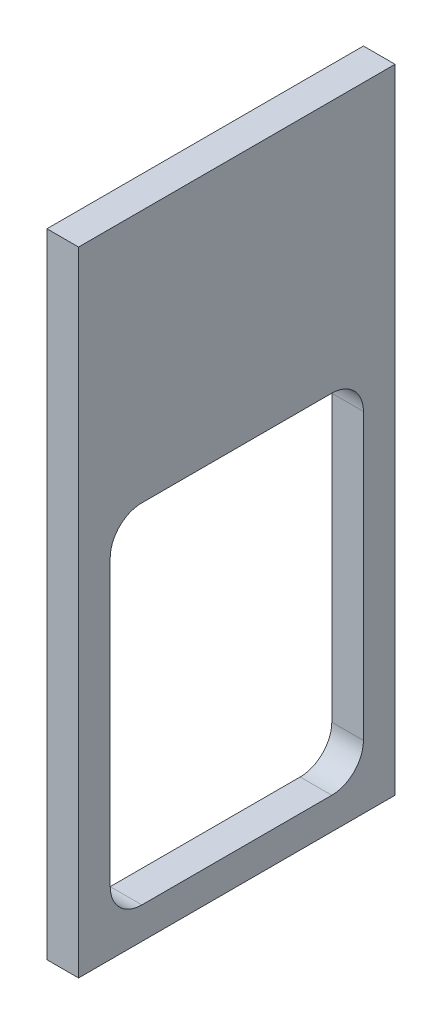
ISO-10303-21;
HEADER;
FILE_DESCRIPTION(('STEP AP214'),'2;1');
FILE_NAME('part.step','',(''),(''),'','','');
FILE_SCHEMA(('AUTOMOTIVE_DESIGN { 1 0 10303 214 1 1 1 1 }'));
ENDSEC;
DATA;
#1=APPLICATION_CONTEXT('core data for automotive mechanical design processes');
#2=APPLICATION_PROTOCOL_DEFINITION('international standard','automotive_design',2000,#1);
#3=PRODUCT_CONTEXT('',#1,'mechanical');
#4=PRODUCT('Part','Part','',(#3));
#5=PRODUCT_RELATED_PRODUCT_CATEGORY('part','',(#4));
#6=PRODUCT_DEFINITION_FORMATION('','',#4);
#7=PRODUCT_DEFINITION_CONTEXT('part definition',#1,'design');
#8=PRODUCT_DEFINITION('design','',#6,#7);
#9=PRODUCT_DEFINITION_SHAPE('','',#8);
#10=(LENGTH_UNIT() NAMED_UNIT(*) SI_UNIT(.MILLI.,.METRE.));
#11=(NAMED_UNIT(*) PLANE_ANGLE_UNIT() SI_UNIT($,.RADIAN.));
#12=(NAMED_UNIT(*) SI_UNIT($,.STERADIAN.) SOLID_ANGLE_UNIT());
#13=UNCERTAINTY_MEASURE_WITH_UNIT(LENGTH_MEASURE(1.E-05),#10,'distance_accuracy_value','');
#14=(GEOMETRIC_REPRESENTATION_CONTEXT(3) GLOBAL_UNCERTAINTY_ASSIGNED_CONTEXT((#13)) GLOBAL_UNIT_ASSIGNED_CONTEXT((#10,
#11,#12)) REPRESENTATION_CONTEXT('',''));
#15=CARTESIAN_POINT('',(0.,0.,0.));
#16=DIRECTION('',(0.,0.,1.));
#17=DIRECTION('',(1.,0.,0.));
#18=AXIS2_PLACEMENT_3D('',#15,#16,#17);
#19=CARTESIAN_POINT('',(10.,-100.,-50.));
#20=DIRECTION('',(0.,0.,1.));
#21=DIRECTION('',(1.,0.,0.));
#22=AXIS2_PLACEMENT_3D('',#19,#20,#21);
#23=PLANE('',#22);
#24=DIRECTION('',(0.,1.,0.));
#25=VECTOR('',#24,1.);
#26=CARTESIAN_POINT('',(0.,-100.,-50.));
#27=LINE('',#26,#25);
#28=CARTESIAN_POINT('',(0.,-100.,-50.));
#29=VERTEX_POINT('',#28);
#30=CARTESIAN_POINT('',(0.,100.,-50.));
#31=VERTEX_POINT('',#30);
#32=EDGE_CURVE('E160',#29,#31,#27,.T.);
#33=ORIENTED_EDGE('',*,*,#32,.T.);
#34=DIRECTION('',(-1.,0.,0.));
#35=VECTOR('',#34,1.);
#36=CARTESIAN_POINT('',(10.,100.,-50.));
#37=LINE('',#36,#35);
#38=CARTESIAN_POINT('',(10.,100.,-50.));
#39=VERTEX_POINT('',#38);
#40=EDGE_CURVE('E139',#39,#31,#37,.T.);
#41=ORIENTED_EDGE('',*,*,#40,.F.);
#42=DIRECTION('',(0.,1.,0.));
#43=VECTOR('',#42,1.);
#44=CARTESIAN_POINT('',(10.,-100.,-50.));
#45=LINE('',#44,#43);
#46=CARTESIAN_POINT('',(10.,-100.,-50.));
#47=VERTEX_POINT('',#46);
#48=EDGE_CURVE('E147',#47,#39,#45,.T.);
#49=ORIENTED_EDGE('',*,*,#48,.F.);
#50=DIRECTION('',(-1.,0.,0.));
#51=VECTOR('',#50,1.);
#52=CARTESIAN_POINT('',(10.,-100.,-50.));
#53=LINE('',#52,#51);
#54=EDGE_CURVE('E259',#47,#29,#53,.T.);
#55=ORIENTED_EDGE('',*,*,#54,.T.);
#56=EDGE_LOOP('',(#33,#41,#49,#55));
#57=FACE_BOUND('',#56,.T.);
#58=ADVANCED_FACE('F45',(#57),#23,.F.);
#59=CARTESIAN_POINT('',(10.,100.,50.));
#60=DIRECTION('',(0.,-1.,0.));
#61=DIRECTION('',(0.,0.,-1.));
#62=AXIS2_PLACEMENT_3D('',#59,#60,#61);
#63=PLANE('',#62);
#64=DIRECTION('',(0.,0.,1.));
#65=VECTOR('',#64,1.);
#66=CARTESIAN_POINT('',(0.,100.,50.));
#67=LINE('',#66,#65);
#68=CARTESIAN_POINT('',(0.,100.,50.));
#69=VERTEX_POINT('',#68);
#70=EDGE_CURVE('E262',#31,#69,#67,.T.);
#71=ORIENTED_EDGE('',*,*,#70,.T.);
#72=DIRECTION('',(-1.,0.,0.));
#73=VECTOR('',#72,1.);
#74=CARTESIAN_POINT('',(10.,100.,50.));
#75=LINE('',#74,#73);
#76=CARTESIAN_POINT('',(10.,100.,50.));
#77=VERTEX_POINT('',#76);
#78=EDGE_CURVE('E142',#77,#69,#75,.T.);
#79=ORIENTED_EDGE('',*,*,#78,.F.);
#80=DIRECTION('',(0.,0.,1.));
#81=VECTOR('',#80,1.);
#82=CARTESIAN_POINT('',(10.,100.,50.));
#83=LINE('',#82,#81);
#84=EDGE_CURVE('E135',#39,#77,#83,.T.);
#85=ORIENTED_EDGE('',*,*,#84,.F.);
#86=ORIENTED_EDGE('',*,*,#40,.T.);
#87=EDGE_LOOP('',(#71,#79,#85,#86));
#88=FACE_BOUND('',#87,.T.);
#89=ADVANCED_FACE('F137',(#88),#63,.F.);
#90=CARTESIAN_POINT('',(10.,-100.,50.));
#91=DIRECTION('',(0.,0.,-1.));
#92=DIRECTION('',(-1.,0.,0.));
#93=AXIS2_PLACEMENT_3D('',#90,#91,#92);
#94=PLANE('',#93);
#95=DIRECTION('',(0.,-1.,0.));
#96=VECTOR('',#95,1.);
#97=CARTESIAN_POINT('',(0.,-100.,50.));
#98=LINE('',#97,#96);
#99=CARTESIAN_POINT('',(0.,-100.,50.));
#100=VERTEX_POINT('',#99);
#101=EDGE_CURVE('E265',#69,#100,#98,.T.);
#102=ORIENTED_EDGE('',*,*,#101,.T.);
#103=DIRECTION('',(-1.,0.,0.));
#104=VECTOR('',#103,1.);
#105=CARTESIAN_POINT('',(10.,-100.,50.));
#106=LINE('',#105,#104);
#107=CARTESIAN_POINT('',(10.,-100.,50.));
#108=VERTEX_POINT('',#107);
#109=EDGE_CURVE('E168',#108,#100,#106,.T.);
#110=ORIENTED_EDGE('',*,*,#109,.F.);
#111=DIRECTION('',(0.,-1.,0.));
#112=VECTOR('',#111,1.);
#113=CARTESIAN_POINT('',(10.,-100.,50.));
#114=LINE('',#113,#112);
#115=EDGE_CURVE('E146',#77,#108,#114,.T.);
#116=ORIENTED_EDGE('',*,*,#115,.F.);
#117=ORIENTED_EDGE('',*,*,#78,.T.);
#118=EDGE_LOOP('',(#102,#110,#116,#117));
#119=FACE_BOUND('',#118,.T.);
#120=ADVANCED_FACE('F281',(#119),#94,.F.);
#121=CARTESIAN_POINT('',(10.,-100.,50.));
#122=DIRECTION('',(0.,1.,0.));
#123=DIRECTION('',(0.,0.,1.));
#124=AXIS2_PLACEMENT_3D('',#121,#122,#123);
#125=PLANE('',#124);
#126=DIRECTION('',(0.,0.,-1.));
#127=VECTOR('',#126,1.);
#128=CARTESIAN_POINT('',(0.,-100.,50.));
#129=LINE('',#128,#127);
#130=EDGE_CURVE('E157',#100,#29,#129,.T.);
#131=ORIENTED_EDGE('',*,*,#130,.T.);
#132=ORIENTED_EDGE('',*,*,#54,.F.);
#133=DIRECTION('',(0.,0.,-1.));
#134=VECTOR('',#133,1.);
#135=CARTESIAN_POINT('',(10.,-100.,50.));
#136=LINE('',#135,#134);
#137=EDGE_CURVE('E152',#108,#47,#136,.T.);
#138=ORIENTED_EDGE('',*,*,#137,.F.);
#139=ORIENTED_EDGE('',*,*,#109,.T.);
#140=EDGE_LOOP('',(#131,#132,#138,#139));
#141=FACE_BOUND('',#140,.T.);
#142=ADVANCED_FACE('F276',(#141),#125,.F.);
#143=CARTESIAN_POINT('',(10.,0.,0.));
#144=DIRECTION('',(-1.,0.,0.));
#145=DIRECTION('',(0.,0.,1.));
#146=AXIS2_PLACEMENT_3D('',#143,#144,#145);
#147=PLANE('',#146);
#148=DIRECTION('',(0.,0.,-1.));
#149=VECTOR('',#148,1.);
#150=CARTESIAN_POINT('',(10.,-90.,40.));
#151=LINE('',#150,#149);
#152=CARTESIAN_POINT('',(10.,-90.,30.));
#153=VERTEX_POINT('',#152);
#154=CARTESIAN_POINT('',(10.,-90.,-30.));
#155=VERTEX_POINT('',#154);
#156=EDGE_CURVE('E218',#153,#155,#151,.T.);
#157=ORIENTED_EDGE('',*,*,#156,.F.);
#158=CARTESIAN_POINT('',(10.,-80.,30.));
#159=DIRECTION('',(-1.,0.,0.));
#160=DIRECTION('',(0.,0.,1.));
#161=AXIS2_PLACEMENT_3D('',#158,#159,#160);
#162=CIRCLE('',#161,10.);
#163=CARTESIAN_POINT('',(10.,-80.,40.));
#164=VERTEX_POINT('',#163);
#165=EDGE_CURVE('E54',#153,#164,#162,.T.);
#166=ORIENTED_EDGE('',*,*,#165,.T.);
#167=DIRECTION('',(0.,-1.,0.));
#168=VECTOR('',#167,1.);
#169=CARTESIAN_POINT('',(10.,-90.,40.));
#170=LINE('',#169,#168);
#171=CARTESIAN_POINT('',(10.,10.,40.));
#172=VERTEX_POINT('',#171);
#173=EDGE_CURVE('E217',#172,#164,#170,.T.);
#174=ORIENTED_EDGE('',*,*,#173,.F.);
#175=CARTESIAN_POINT('',(10.,10.,30.));
#176=DIRECTION('',(-1.,0.,0.));
#177=DIRECTION('',(0.,0.,1.));
#178=AXIS2_PLACEMENT_3D('',#175,#176,#177);
#179=CIRCLE('',#178,10.);
#180=CARTESIAN_POINT('',(10.,20.,30.));
#181=VERTEX_POINT('',#180);
#182=EDGE_CURVE('E195',#172,#181,#179,.T.);
#183=ORIENTED_EDGE('',*,*,#182,.T.);
#184=DIRECTION('',(0.,0.,1.));
#185=VECTOR('',#184,1.);
#186=CARTESIAN_POINT('',(10.,20.,40.));
#187=LINE('',#186,#185);
#188=CARTESIAN_POINT('',(10.,20.,-30.));
#189=VERTEX_POINT('',#188);
#190=EDGE_CURVE('E240',#189,#181,#187,.T.);
#191=ORIENTED_EDGE('',*,*,#190,.F.);
#192=CARTESIAN_POINT('',(10.,10.,-30.));
#193=DIRECTION('',(-1.,0.,0.));
#194=DIRECTION('',(0.,0.,1.));
#195=AXIS2_PLACEMENT_3D('',#192,#193,#194);
#196=CIRCLE('',#195,10.);
#197=CARTESIAN_POINT('',(10.,10.,-40.));
#198=VERTEX_POINT('',#197);
#199=EDGE_CURVE('E201',#189,#198,#196,.T.);
#200=ORIENTED_EDGE('',*,*,#199,.T.);
#201=DIRECTION('',(0.,1.,0.));
#202=VECTOR('',#201,1.);
#203=CARTESIAN_POINT('',(10.,-90.,-40.));
#204=LINE('',#203,#202);
#205=CARTESIAN_POINT('',(10.,-80.,-40.));
#206=VERTEX_POINT('',#205);
#207=EDGE_CURVE('E248',#206,#198,#204,.T.);
#208=ORIENTED_EDGE('',*,*,#207,.F.);
#209=CARTESIAN_POINT('',(10.,-80.,-30.));
#210=DIRECTION('',(-1.,0.,0.));
#211=DIRECTION('',(0.,0.,1.));
#212=AXIS2_PLACEMENT_3D('',#209,#210,#211);
#213=CIRCLE('',#212,10.);
#214=EDGE_CURVE('E207',#206,#155,#213,.T.);
#215=ORIENTED_EDGE('',*,*,#214,.T.);
#216=EDGE_LOOP('',(#157,#166,#174,#183,#191,#200,#208,#215));
#217=FACE_BOUND('',#216,.T.);
#218=ORIENTED_EDGE('',*,*,#48,.T.);
#219=ORIENTED_EDGE('',*,*,#84,.T.);
#220=ORIENTED_EDGE('',*,*,#115,.T.);
#221=ORIENTED_EDGE('',*,*,#137,.T.);
#222=EDGE_LOOP('',(#218,#219,#220,#221));
#223=FACE_BOUND('',#222,.T.);
#224=ADVANCED_FACE('F150',(#217,#223),#147,.F.);
#225=CARTESIAN_POINT('',(0.,0.,0.));
#226=DIRECTION('',(-1.,0.,0.));
#227=DIRECTION('',(0.,0.,1.));
#228=AXIS2_PLACEMENT_3D('',#225,#226,#227);
#229=PLANE('',#228);
#230=DIRECTION('',(0.,0.,1.));
#231=VECTOR('',#230,1.);
#232=CARTESIAN_POINT('',(0.,20.,40.));
#233=LINE('',#232,#231);
#234=CARTESIAN_POINT('',(0.,20.,-30.));
#235=VERTEX_POINT('',#234);
#236=CARTESIAN_POINT('',(0.,20.,30.));
#237=VERTEX_POINT('',#236);
#238=EDGE_CURVE('E238',#235,#237,#233,.T.);
#239=ORIENTED_EDGE('',*,*,#238,.T.);
#240=CARTESIAN_POINT('',(0.,10.,30.));
#241=DIRECTION('',(-1.,0.,0.));
#242=DIRECTION('',(0.,0.,1.));
#243=AXIS2_PLACEMENT_3D('',#240,#241,#242);
#244=CIRCLE('',#243,10.);
#245=CARTESIAN_POINT('',(0.,10.,40.));
#246=VERTEX_POINT('',#245);
#247=EDGE_CURVE('E198',#237,#246,#244,.F.);
#248=ORIENTED_EDGE('',*,*,#247,.T.);
#249=DIRECTION('',(0.,-1.,0.));
#250=VECTOR('',#249,1.);
#251=CARTESIAN_POINT('',(0.,-90.,40.));
#252=LINE('',#251,#250);
#253=CARTESIAN_POINT('',(0.,-80.,40.));
#254=VERTEX_POINT('',#253);
#255=EDGE_CURVE('E233',#246,#254,#252,.T.);
#256=ORIENTED_EDGE('',*,*,#255,.T.);
#257=CARTESIAN_POINT('',(0.,-80.,30.));
#258=DIRECTION('',(-1.,0.,0.));
#259=DIRECTION('',(0.,0.,1.));
#260=AXIS2_PLACEMENT_3D('',#257,#258,#259);
#261=CIRCLE('',#260,10.);
#262=CARTESIAN_POINT('',(0.,-90.,30.));
#263=VERTEX_POINT('',#262);
#264=EDGE_CURVE('E11',#254,#263,#261,.F.);
#265=ORIENTED_EDGE('',*,*,#264,.T.);
#266=DIRECTION('',(0.,0.,-1.));
#267=VECTOR('',#266,1.);
#268=CARTESIAN_POINT('',(0.,-90.,40.));
#269=LINE('',#268,#267);
#270=CARTESIAN_POINT('',(0.,-90.,-30.));
#271=VERTEX_POINT('',#270);
#272=EDGE_CURVE('E229',#263,#271,#269,.T.);
#273=ORIENTED_EDGE('',*,*,#272,.T.);
#274=CARTESIAN_POINT('',(0.,-80.,-30.));
#275=DIRECTION('',(-1.,0.,0.));
#276=DIRECTION('',(0.,0.,1.));
#277=AXIS2_PLACEMENT_3D('',#274,#275,#276);
#278=CIRCLE('',#277,10.);
#279=CARTESIAN_POINT('',(0.,-80.,-40.));
#280=VERTEX_POINT('',#279);
#281=EDGE_CURVE('E210',#271,#280,#278,.F.);
#282=ORIENTED_EDGE('',*,*,#281,.T.);
#283=DIRECTION('',(0.,1.,0.));
#284=VECTOR('',#283,1.);
#285=CARTESIAN_POINT('',(0.,-90.,-40.));
#286=LINE('',#285,#284);
#287=CARTESIAN_POINT('',(0.,10.,-40.));
#288=VERTEX_POINT('',#287);
#289=EDGE_CURVE('E232',#280,#288,#286,.T.);
#290=ORIENTED_EDGE('',*,*,#289,.T.);
#291=CARTESIAN_POINT('',(0.,10.,-30.));
#292=DIRECTION('',(-1.,0.,0.));
#293=DIRECTION('',(0.,0.,1.));
#294=AXIS2_PLACEMENT_3D('',#291,#292,#293);
#295=CIRCLE('',#294,10.);
#296=EDGE_CURVE('E204',#288,#235,#295,.F.);
#297=ORIENTED_EDGE('',*,*,#296,.T.);
#298=EDGE_LOOP('',(#239,#248,#256,#265,#273,#282,#290,#297));
#299=FACE_BOUND('',#298,.T.);
#300=ORIENTED_EDGE('',*,*,#32,.F.);
#301=ORIENTED_EDGE('',*,*,#130,.F.);
#302=ORIENTED_EDGE('',*,*,#101,.F.);
#303=ORIENTED_EDGE('',*,*,#70,.F.);
#304=EDGE_LOOP('',(#300,#301,#302,#303));
#305=FACE_BOUND('',#304,.T.);
#306=ADVANCED_FACE('F280',(#299,#305),#229,.T.);
#307=CARTESIAN_POINT('',(0.,-90.,40.));
#308=DIRECTION('',(0.,0.,1.));
#309=DIRECTION('',(1.,0.,0.));
#310=AXIS2_PLACEMENT_3D('',#307,#308,#309);
#311=PLANE('',#310);
#312=ORIENTED_EDGE('',*,*,#255,.F.);
#313=DIRECTION('',(1.,0.,0.));
#314=VECTOR('',#313,1.);
#315=CARTESIAN_POINT('',(10.,10.,40.));
#316=LINE('',#315,#314);
#317=EDGE_CURVE('E166',#246,#172,#316,.T.);
#318=ORIENTED_EDGE('',*,*,#317,.T.);
#319=ORIENTED_EDGE('',*,*,#173,.T.);
#320=DIRECTION('',(1.,0.,0.));
#321=VECTOR('',#320,1.);
#322=CARTESIAN_POINT('',(0.,-80.,40.));
#323=LINE('',#322,#321);
#324=EDGE_CURVE('E162',#164,#254,#323,.F.);
#325=ORIENTED_EDGE('',*,*,#324,.T.);
#326=EDGE_LOOP('',(#312,#318,#319,#325));
#327=FACE_BOUND('',#326,.T.);
#328=ADVANCED_FACE('F224',(#327),#311,.F.);
#329=CARTESIAN_POINT('',(0.,20.,40.));
#330=DIRECTION('',(0.,1.,0.));
#331=DIRECTION('',(0.,0.,1.));
#332=AXIS2_PLACEMENT_3D('',#329,#330,#331);
#333=PLANE('',#332);
#334=ORIENTED_EDGE('',*,*,#190,.T.);
#335=DIRECTION('',(1.,0.,0.));
#336=VECTOR('',#335,1.);
#337=CARTESIAN_POINT('',(0.,20.,30.));
#338=LINE('',#337,#336);
#339=EDGE_CURVE('E179',#181,#237,#338,.F.);
#340=ORIENTED_EDGE('',*,*,#339,.T.);
#341=ORIENTED_EDGE('',*,*,#238,.F.);
#342=DIRECTION('',(1.,0.,0.));
#343=VECTOR('',#342,1.);
#344=CARTESIAN_POINT('',(10.,20.,-30.));
#345=LINE('',#344,#343);
#346=EDGE_CURVE('E175',#235,#189,#345,.T.);
#347=ORIENTED_EDGE('',*,*,#346,.T.);
#348=EDGE_LOOP('',(#334,#340,#341,#347));
#349=FACE_BOUND('',#348,.T.);
#350=ADVANCED_FACE('F319',(#349),#333,.F.);
#351=CARTESIAN_POINT('',(0.,-90.,-40.));
#352=DIRECTION('',(0.,0.,-1.));
#353=DIRECTION('',(-1.,0.,0.));
#354=AXIS2_PLACEMENT_3D('',#351,#352,#353);
#355=PLANE('',#354);
#356=ORIENTED_EDGE('',*,*,#207,.T.);
#357=DIRECTION('',(1.,0.,0.));
#358=VECTOR('',#357,1.);
#359=CARTESIAN_POINT('',(0.,10.,-40.));
#360=LINE('',#359,#358);
#361=EDGE_CURVE('E186',#198,#288,#360,.F.);
#362=ORIENTED_EDGE('',*,*,#361,.T.);
#363=ORIENTED_EDGE('',*,*,#289,.F.);
#364=DIRECTION('',(1.,0.,0.));
#365=VECTOR('',#364,1.);
#366=CARTESIAN_POINT('',(10.,-80.,-40.));
#367=LINE('',#366,#365);
#368=EDGE_CURVE('E182',#280,#206,#367,.T.);
#369=ORIENTED_EDGE('',*,*,#368,.T.);
#370=EDGE_LOOP('',(#356,#362,#363,#369));
#371=FACE_BOUND('',#370,.T.);
#372=ADVANCED_FACE('F312',(#371),#355,.F.);
#373=CARTESIAN_POINT('',(0.,-90.,40.));
#374=DIRECTION('',(0.,-1.,0.));
#375=DIRECTION('',(0.,0.,-1.));
#376=AXIS2_PLACEMENT_3D('',#373,#374,#375);
#377=PLANE('',#376);
#378=ORIENTED_EDGE('',*,*,#156,.T.);
#379=DIRECTION('',(1.,0.,0.));
#380=VECTOR('',#379,1.);
#381=CARTESIAN_POINT('',(0.,-90.,-30.));
#382=LINE('',#381,#380);
#383=EDGE_CURVE('E61',#155,#271,#382,.F.);
#384=ORIENTED_EDGE('',*,*,#383,.T.);
#385=ORIENTED_EDGE('',*,*,#272,.F.);
#386=DIRECTION('',(1.,0.,0.));
#387=VECTOR('',#386,1.);
#388=CARTESIAN_POINT('',(10.,-90.,30.));
#389=LINE('',#388,#387);
#390=EDGE_CURVE('E189',#263,#153,#389,.T.);
#391=ORIENTED_EDGE('',*,*,#390,.T.);
#392=EDGE_LOOP('',(#378,#384,#385,#391));
#393=FACE_BOUND('',#392,.T.);
#394=ADVANCED_FACE('F228',(#393),#377,.F.);
#395=CARTESIAN_POINT('',(0.,10.,30.));
#396=DIRECTION('',(-1.,0.,0.));
#397=DIRECTION('',(0.,0.,1.));
#398=AXIS2_PLACEMENT_3D('',#395,#396,#397);
#399=CYLINDRICAL_SURFACE('',#398,10.);
#400=ORIENTED_EDGE('',*,*,#247,.F.);
#401=ORIENTED_EDGE('',*,*,#339,.F.);
#402=ORIENTED_EDGE('',*,*,#182,.F.);
#403=ORIENTED_EDGE('',*,*,#317,.F.);
#404=EDGE_LOOP('',(#400,#401,#402,#403));
#405=FACE_BOUND('',#404,.T.);
#406=ADVANCED_FACE('F295',(#405),#399,.F.);
#407=CARTESIAN_POINT('',(0.,10.,-30.));
#408=DIRECTION('',(-1.,0.,0.));
#409=DIRECTION('',(0.,0.,1.));
#410=AXIS2_PLACEMENT_3D('',#407,#408,#409);
#411=CYLINDRICAL_SURFACE('',#410,10.);
#412=ORIENTED_EDGE('',*,*,#296,.F.);
#413=ORIENTED_EDGE('',*,*,#361,.F.);
#414=ORIENTED_EDGE('',*,*,#199,.F.);
#415=ORIENTED_EDGE('',*,*,#346,.F.);
#416=EDGE_LOOP('',(#412,#413,#414,#415));
#417=FACE_BOUND('',#416,.T.);
#418=ADVANCED_FACE('F298',(#417),#411,.F.);
#419=CARTESIAN_POINT('',(0.,-80.,-30.));
#420=DIRECTION('',(-1.,0.,0.));
#421=DIRECTION('',(0.,0.,1.));
#422=AXIS2_PLACEMENT_3D('',#419,#420,#421);
#423=CYLINDRICAL_SURFACE('',#422,10.);
#424=ORIENTED_EDGE('',*,*,#281,.F.);
#425=ORIENTED_EDGE('',*,*,#383,.F.);
#426=ORIENTED_EDGE('',*,*,#214,.F.);
#427=ORIENTED_EDGE('',*,*,#368,.F.);
#428=EDGE_LOOP('',(#424,#425,#426,#427));
#429=FACE_BOUND('',#428,.T.);
#430=ADVANCED_FACE('F301',(#429),#423,.F.);
#431=CARTESIAN_POINT('',(0.,-80.,30.));
#432=DIRECTION('',(-1.,0.,0.));
#433=DIRECTION('',(0.,0.,1.));
#434=AXIS2_PLACEMENT_3D('',#431,#432,#433);
#435=CYLINDRICAL_SURFACE('',#434,10.);
#436=ORIENTED_EDGE('',*,*,#264,.F.);
#437=ORIENTED_EDGE('',*,*,#324,.F.);
#438=ORIENTED_EDGE('',*,*,#165,.F.);
#439=ORIENTED_EDGE('',*,*,#390,.F.);
#440=EDGE_LOOP('',(#436,#437,#438,#439));
#441=FACE_BOUND('',#440,.T.);
#442=ADVANCED_FACE('F47',(#441),#435,.F.);
#443=CLOSED_SHELL('',(#58,#89,#120,#142,#224,#306,#328,#350,#372,#394,#406,#418,#430,#442));
#444=MANIFOLD_SOLID_BREP('B2',#443);
#445=ADVANCED_BREP_SHAPE_REPRESENTATION('',(#18,#444),#14);
#446=SHAPE_DEFINITION_REPRESENTATION(#9,#445);
ENDSEC;
END-ISO-10303-21;
